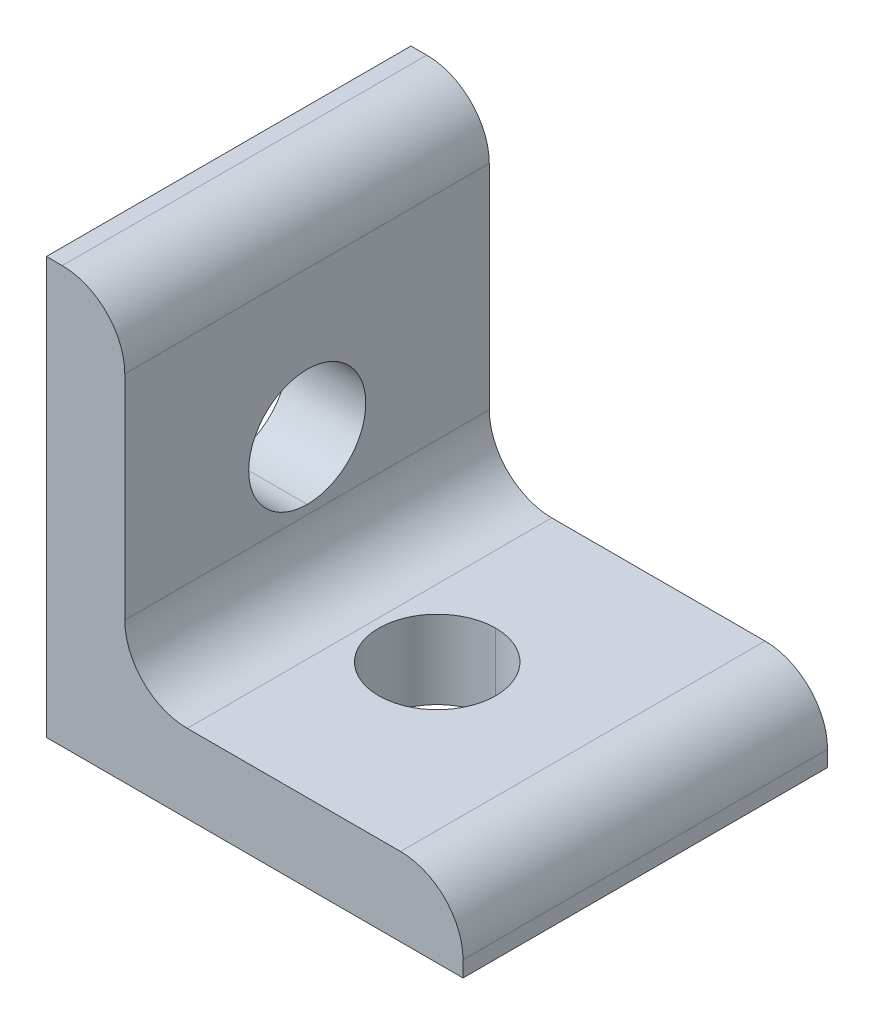
ISO-10303-21;
HEADER;
FILE_DESCRIPTION(('STEP AP214'),'2;1');
FILE_NAME('part.step','',(''),(''),'','','');
FILE_SCHEMA(('AUTOMOTIVE_DESIGN { 1 0 10303 214 1 1 1 1 }'));
ENDSEC;
DATA;
#1=APPLICATION_CONTEXT('core data for automotive mechanical design processes');
#2=APPLICATION_PROTOCOL_DEFINITION('international standard','automotive_design',2000,#1);
#3=PRODUCT_CONTEXT('',#1,'mechanical');
#4=PRODUCT('Part','Part','',(#3));
#5=PRODUCT_RELATED_PRODUCT_CATEGORY('part','',(#4));
#6=PRODUCT_DEFINITION_FORMATION('','',#4);
#7=PRODUCT_DEFINITION_CONTEXT('part definition',#1,'design');
#8=PRODUCT_DEFINITION('design','',#6,#7);
#9=PRODUCT_DEFINITION_SHAPE('','',#8);
#10=(LENGTH_UNIT() NAMED_UNIT(*) SI_UNIT(.MILLI.,.METRE.));
#11=(NAMED_UNIT(*) PLANE_ANGLE_UNIT() SI_UNIT($,.RADIAN.));
#12=(NAMED_UNIT(*) SI_UNIT($,.STERADIAN.) SOLID_ANGLE_UNIT());
#13=UNCERTAINTY_MEASURE_WITH_UNIT(LENGTH_MEASURE(1.E-05),#10,'distance_accuracy_value','');
#14=(GEOMETRIC_REPRESENTATION_CONTEXT(3) GLOBAL_UNCERTAINTY_ASSIGNED_CONTEXT((#13)) GLOBAL_UNIT_ASSIGNED_CONTEXT((#10,
#11,#12)) REPRESENTATION_CONTEXT('',''));
#15=CARTESIAN_POINT('',(0.,0.,0.));
#16=DIRECTION('',(0.,0.,1.));
#17=DIRECTION('',(1.,0.,0.));
#18=AXIS2_PLACEMENT_3D('',#15,#16,#17);
#19=CARTESIAN_POINT('',(12.7,0.,-0.0127));
#20=DIRECTION('',(0.,1.,0.));
#21=DIRECTION('',(0.,0.,-1.));
#22=AXIS2_PLACEMENT_3D('',#19,#20,#21);
#23=CYLINDRICAL_SURFACE('',#22,3.5687);
#24=DIRECTION('',(0.,-1.,0.));
#25=VECTOR('',#24,1.);
#26=CARTESIAN_POINT('',(12.7,4.7752,3.556));
#27=LINE('',#26,#25);
#28=CARTESIAN_POINT('',(12.7,4.7752,3.556));
#29=VERTEX_POINT('',#28);
#30=CARTESIAN_POINT('',(12.7,0.,3.556));
#31=VERTEX_POINT('',#30);
#32=EDGE_CURVE('E19',#29,#31,#27,.T.);
#33=ORIENTED_EDGE('',*,*,#32,.F.);
#34=CARTESIAN_POINT('',(12.7,4.7752,-0.0127));
#35=DIRECTION('',(0.,1.,0.));
#36=DIRECTION('',(0.,0.,1.));
#37=AXIS2_PLACEMENT_3D('',#34,#35,#36);
#38=CIRCLE('',#37,3.5687);
#39=CARTESIAN_POINT('',(12.7,4.7752,-3.5814));
#40=VERTEX_POINT('',#39);
#41=EDGE_CURVE('E160',#29,#40,#38,.T.);
#42=ORIENTED_EDGE('',*,*,#41,.T.);
#43=DIRECTION('',(0.,-1.,0.));
#44=VECTOR('',#43,1.);
#45=CARTESIAN_POINT('',(12.7,4.7752,-3.5814));
#46=LINE('',#45,#44);
#47=CARTESIAN_POINT('',(12.7,0.,-3.5814));
#48=VERTEX_POINT('',#47);
#49=EDGE_CURVE('E10',#40,#48,#46,.T.);
#50=ORIENTED_EDGE('',*,*,#49,.T.);
#51=CARTESIAN_POINT('',(12.7,0.,-0.0127));
#52=DIRECTION('',(0.,-1.,0.));
#53=DIRECTION('',(0.,0.,-1.));
#54=AXIS2_PLACEMENT_3D('',#51,#52,#53);
#55=CIRCLE('',#54,3.5687);
#56=EDGE_CURVE('E182',#48,#31,#55,.T.);
#57=ORIENTED_EDGE('',*,*,#56,.T.);
#58=EDGE_LOOP('',(#33,#42,#50,#57));
#59=FACE_BOUND('',#58,.T.);
#60=ADVANCED_FACE('F16',(#59),#23,.F.);
#61=CARTESIAN_POINT('',(12.7,0.,-0.0127));
#62=DIRECTION('',(0.,1.,0.));
#63=DIRECTION('',(0.,0.,-1.));
#64=AXIS2_PLACEMENT_3D('',#61,#62,#63);
#65=CYLINDRICAL_SURFACE('',#64,3.5687);
#66=ORIENTED_EDGE('',*,*,#49,.F.);
#67=CARTESIAN_POINT('',(12.7,4.7752,-0.0127));
#68=DIRECTION('',(0.,1.,0.));
#69=DIRECTION('',(0.,0.,-1.));
#70=AXIS2_PLACEMENT_3D('',#67,#68,#69);
#71=CIRCLE('',#70,3.5687);
#72=EDGE_CURVE('E157',#40,#29,#71,.T.);
#73=ORIENTED_EDGE('',*,*,#72,.T.);
#74=ORIENTED_EDGE('',*,*,#32,.T.);
#75=CARTESIAN_POINT('',(12.7,0.,-0.0127));
#76=DIRECTION('',(0.,-1.,0.));
#77=DIRECTION('',(0.,0.,1.));
#78=AXIS2_PLACEMENT_3D('',#75,#76,#77);
#79=CIRCLE('',#78,3.5687);
#80=EDGE_CURVE('E179',#31,#48,#79,.T.);
#81=ORIENTED_EDGE('',*,*,#80,.T.);
#82=EDGE_LOOP('',(#66,#73,#74,#81));
#83=FACE_BOUND('',#82,.T.);
#84=ADVANCED_FACE('F221',(#83),#65,.F.);
#85=CARTESIAN_POINT('',(0.,12.7,-0.0127));
#86=DIRECTION('',(1.,0.,0.));
#87=DIRECTION('',(0.,1.,0.));
#88=AXIS2_PLACEMENT_3D('',#85,#86,#87);
#89=CYLINDRICAL_SURFACE('',#88,3.5687);
#90=DIRECTION('',(-1.,0.,0.));
#91=VECTOR('',#90,1.);
#92=CARTESIAN_POINT('',(4.7752,16.2687,-0.0127));
#93=LINE('',#92,#91);
#94=CARTESIAN_POINT('',(4.7752,16.2687,-0.0127));
#95=VERTEX_POINT('',#94);
#96=CARTESIAN_POINT('',(0.,16.2687,-0.0127));
#97=VERTEX_POINT('',#96);
#98=EDGE_CURVE('E30',#95,#97,#93,.T.);
#99=ORIENTED_EDGE('',*,*,#98,.T.);
#100=CARTESIAN_POINT('',(0.,12.7,-0.0127));
#101=DIRECTION('',(-1.,0.,0.));
#102=DIRECTION('',(0.,1.,0.));
#103=AXIS2_PLACEMENT_3D('',#100,#101,#102);
#104=CIRCLE('',#103,3.5687);
#105=CARTESIAN_POINT('',(0.,9.1313,-0.0126999999999994));
#106=VERTEX_POINT('',#105);
#107=EDGE_CURVE('E35',#97,#106,#104,.T.);
#108=ORIENTED_EDGE('',*,*,#107,.T.);
#109=DIRECTION('',(-1.,0.,0.));
#110=VECTOR('',#109,1.);
#111=CARTESIAN_POINT('',(4.7752,9.1313,-0.0126999999999996));
#112=LINE('',#111,#110);
#113=CARTESIAN_POINT('',(4.7752,9.1313,-0.0126999999999994));
#114=VERTEX_POINT('',#113);
#115=EDGE_CURVE('E214',#114,#106,#112,.T.);
#116=ORIENTED_EDGE('',*,*,#115,.F.);
#117=CARTESIAN_POINT('',(4.7752,12.7,-0.0127));
#118=DIRECTION('',(1.,0.,0.));
#119=DIRECTION('',(0.,-1.,0.));
#120=AXIS2_PLACEMENT_3D('',#117,#118,#119);
#121=CIRCLE('',#120,3.5687);
#122=EDGE_CURVE('E147',#114,#95,#121,.T.);
#123=ORIENTED_EDGE('',*,*,#122,.T.);
#124=EDGE_LOOP('',(#99,#108,#116,#123));
#125=FACE_BOUND('',#124,.T.);
#126=ADVANCED_FACE('F268',(#125),#89,.F.);
#127=CARTESIAN_POINT('',(0.,12.7,-0.0127));
#128=DIRECTION('',(1.,0.,0.));
#129=DIRECTION('',(0.,1.,0.));
#130=AXIS2_PLACEMENT_3D('',#127,#128,#129);
#131=CYLINDRICAL_SURFACE('',#130,3.5687);
#132=ORIENTED_EDGE('',*,*,#115,.T.);
#133=CARTESIAN_POINT('',(0.,12.7,-0.0127));
#134=DIRECTION('',(-1.,0.,0.));
#135=DIRECTION('',(0.,-1.,0.));
#136=AXIS2_PLACEMENT_3D('',#133,#134,#135);
#137=CIRCLE('',#136,3.5687);
#138=EDGE_CURVE('E190',#106,#97,#137,.T.);
#139=ORIENTED_EDGE('',*,*,#138,.T.);
#140=ORIENTED_EDGE('',*,*,#98,.F.);
#141=CARTESIAN_POINT('',(4.7752,12.7,-0.0127));
#142=DIRECTION('',(1.,0.,0.));
#143=DIRECTION('',(0.,1.,0.));
#144=AXIS2_PLACEMENT_3D('',#141,#142,#143);
#145=CIRCLE('',#144,3.5687);
#146=EDGE_CURVE('E144',#95,#114,#145,.T.);
#147=ORIENTED_EDGE('',*,*,#146,.T.);
#148=EDGE_LOOP('',(#132,#139,#140,#147));
#149=FACE_BOUND('',#148,.T.);
#150=ADVANCED_FACE('F262',(#149),#131,.F.);
#151=CARTESIAN_POINT('',(0.,0.,11.1125));
#152=DIRECTION('',(0.,0.,1.));
#153=DIRECTION('',(1.,0.,0.));
#154=AXIS2_PLACEMENT_3D('',#151,#152,#153);
#155=PLANE('',#154);
#156=DIRECTION('',(1.,0.,0.));
#157=VECTOR('',#156,1.);
#158=CARTESIAN_POINT('',(0.,25.4,11.1125));
#159=LINE('',#158,#157);
#160=CARTESIAN_POINT('',(0.,25.4,11.1125));
#161=VERTEX_POINT('',#160);
#162=CARTESIAN_POINT('',(0.9652,25.4,11.1125));
#163=VERTEX_POINT('',#162);
#164=EDGE_CURVE('E194',#161,#163,#159,.T.);
#165=ORIENTED_EDGE('',*,*,#164,.F.);
#166=DIRECTION('',(0.,1.,0.));
#167=VECTOR('',#166,1.);
#168=CARTESIAN_POINT('',(0.,0.,11.1125));
#169=LINE('',#168,#167);
#170=CARTESIAN_POINT('',(0.,0.,11.1125));
#171=VERTEX_POINT('',#170);
#172=EDGE_CURVE('E192',#171,#161,#169,.T.);
#173=ORIENTED_EDGE('',*,*,#172,.F.);
#174=DIRECTION('',(-1.,0.,0.));
#175=VECTOR('',#174,1.);
#176=CARTESIAN_POINT('',(25.4,0.,11.1125));
#177=LINE('',#176,#175);
#178=CARTESIAN_POINT('',(25.4,0.,11.1125));
#179=VERTEX_POINT('',#178);
#180=EDGE_CURVE('E183',#179,#171,#177,.T.);
#181=ORIENTED_EDGE('',*,*,#180,.F.);
#182=DIRECTION('',(0.,-1.,0.));
#183=VECTOR('',#182,1.);
#184=CARTESIAN_POINT('',(25.4,0.965200000000254,11.1125));
#185=LINE('',#184,#183);
#186=CARTESIAN_POINT('',(25.4,0.965200000000254,11.1125));
#187=VERTEX_POINT('',#186);
#188=EDGE_CURVE('E178',#187,#179,#185,.T.);
#189=ORIENTED_EDGE('',*,*,#188,.F.);
#190=CARTESIAN_POINT('',(21.59,0.965200000000254,11.1125));
#191=DIRECTION('',(0.,0.,-1.));
#192=DIRECTION('',(7.60364358236553E-13,1.,0.));
#193=AXIS2_PLACEMENT_3D('',#190,#191,#192);
#194=CIRCLE('',#193,3.81);
#195=CARTESIAN_POINT('',(21.590000000001,4.77520000000008,11.1125));
#196=VERTEX_POINT('',#195);
#197=EDGE_CURVE('E166',#196,#187,#194,.T.);
#198=ORIENTED_EDGE('',*,*,#197,.F.);
#199=DIRECTION('',(1.,0.,0.));
#200=VECTOR('',#199,1.);
#201=CARTESIAN_POINT('',(8.58520000000001,4.7752,11.1125));
#202=LINE('',#201,#200);
#203=CARTESIAN_POINT('',(8.5852,4.7752,11.1125));
#204=VERTEX_POINT('',#203);
#205=EDGE_CURVE('E161',#204,#196,#202,.T.);
#206=ORIENTED_EDGE('',*,*,#205,.F.);
#207=CARTESIAN_POINT('',(8.5852,8.5852,11.1125));
#208=DIRECTION('',(0.,0.,1.));
#209=DIRECTION('',(-1.,0.,0.));
#210=AXIS2_PLACEMENT_3D('',#207,#208,#209);
#211=CIRCLE('',#210,3.81);
#212=CARTESIAN_POINT('',(4.7752,8.5852,11.1125));
#213=VERTEX_POINT('',#212);
#214=EDGE_CURVE('E154',#213,#204,#211,.T.);
#215=ORIENTED_EDGE('',*,*,#214,.F.);
#216=DIRECTION('',(0.,-1.,0.));
#217=VECTOR('',#216,1.);
#218=CARTESIAN_POINT('',(4.7752,21.59,11.1125));
#219=LINE('',#218,#217);
#220=CARTESIAN_POINT('',(4.7752,21.59,11.1125));
#221=VERTEX_POINT('',#220);
#222=EDGE_CURVE('E148',#221,#213,#219,.T.);
#223=ORIENTED_EDGE('',*,*,#222,.F.);
#224=CARTESIAN_POINT('',(0.9652,21.59,11.1125));
#225=DIRECTION('',(0.,0.,-1.));
#226=DIRECTION('',(0.,1.,0.));
#227=AXIS2_PLACEMENT_3D('',#224,#225,#226);
#228=CIRCLE('',#227,3.81);
#229=EDGE_CURVE('E128',#163,#221,#228,.T.);
#230=ORIENTED_EDGE('',*,*,#229,.F.);
#231=EDGE_LOOP('',(#165,#173,#181,#189,#198,#206,#215,#223,#230));
#232=FACE_BOUND('',#231,.T.);
#233=ADVANCED_FACE('F241',(#232),#155,.T.);
#234=CARTESIAN_POINT('',(4.7752,25.4,-11.1125));
#235=DIRECTION('',(0.,1.,0.));
#236=DIRECTION('',(-1.,0.,0.));
#237=AXIS2_PLACEMENT_3D('',#234,#235,#236);
#238=PLANE('',#237);
#239=DIRECTION('',(1.,0.,0.));
#240=VECTOR('',#239,1.);
#241=CARTESIAN_POINT('',(0.,25.4,-11.1125));
#242=LINE('',#241,#240);
#243=CARTESIAN_POINT('',(0.,25.4,-11.1125));
#244=VERTEX_POINT('',#243);
#245=CARTESIAN_POINT('',(0.9652,25.4,-11.1125));
#246=VERTEX_POINT('',#245);
#247=EDGE_CURVE('E132',#244,#246,#242,.T.);
#248=ORIENTED_EDGE('',*,*,#247,.F.);
#249=DIRECTION('',(0.,0.,-1.));
#250=VECTOR('',#249,1.);
#251=CARTESIAN_POINT('',(0.,25.4,11.1125));
#252=LINE('',#251,#250);
#253=EDGE_CURVE('E185',#161,#244,#252,.T.);
#254=ORIENTED_EDGE('',*,*,#253,.F.);
#255=ORIENTED_EDGE('',*,*,#164,.T.);
#256=DIRECTION('',(0.,0.,-1.));
#257=VECTOR('',#256,1.);
#258=CARTESIAN_POINT('',(0.9652,25.4,11.1125));
#259=LINE('',#258,#257);
#260=EDGE_CURVE('E142',#163,#246,#259,.T.);
#261=ORIENTED_EDGE('',*,*,#260,.T.);
#262=EDGE_LOOP('',(#248,#254,#255,#261));
#263=FACE_BOUND('',#262,.T.);
#264=ADVANCED_FACE('F252',(#263),#238,.T.);
#265=CARTESIAN_POINT('',(0.,25.4,-11.1125));
#266=DIRECTION('',(-1.,0.,0.));
#267=DIRECTION('',(0.,-1.,0.));
#268=AXIS2_PLACEMENT_3D('',#265,#266,#267);
#269=PLANE('',#268);
#270=ORIENTED_EDGE('',*,*,#107,.F.);
#271=ORIENTED_EDGE('',*,*,#138,.F.);
#272=EDGE_LOOP('',(#270,#271));
#273=FACE_BOUND('',#272,.T.);
#274=DIRECTION('',(0.,0.,-1.));
#275=VECTOR('',#274,1.);
#276=CARTESIAN_POINT('',(0.,0.,11.1125));
#277=LINE('',#276,#275);
#278=CARTESIAN_POINT('',(0.,0.,-11.1125));
#279=VERTEX_POINT('',#278);
#280=EDGE_CURVE('E187',#171,#279,#277,.T.);
#281=ORIENTED_EDGE('',*,*,#280,.F.);
#282=ORIENTED_EDGE('',*,*,#172,.T.);
#283=ORIENTED_EDGE('',*,*,#253,.T.);
#284=DIRECTION('',(0.,1.,0.));
#285=VECTOR('',#284,1.);
#286=CARTESIAN_POINT('',(0.,0.,-11.1125));
#287=LINE('',#286,#285);
#288=EDGE_CURVE('E134',#279,#244,#287,.T.);
#289=ORIENTED_EDGE('',*,*,#288,.F.);
#290=EDGE_LOOP('',(#281,#282,#283,#289));
#291=FACE_BOUND('',#290,.T.);
#292=ADVANCED_FACE('F249',(#273,#291),#269,.T.);
#293=CARTESIAN_POINT('',(0.,0.,-11.1125));
#294=DIRECTION('',(0.,-1.,0.));
#295=DIRECTION('',(1.,0.,0.));
#296=AXIS2_PLACEMENT_3D('',#293,#294,#295);
#297=PLANE('',#296);
#298=ORIENTED_EDGE('',*,*,#56,.F.);
#299=ORIENTED_EDGE('',*,*,#80,.F.);
#300=EDGE_LOOP('',(#298,#299));
#301=FACE_BOUND('',#300,.T.);
#302=DIRECTION('',(0.,0.,-1.));
#303=VECTOR('',#302,1.);
#304=CARTESIAN_POINT('',(25.4,0.,11.1125));
#305=LINE('',#304,#303);
#306=CARTESIAN_POINT('',(25.4,0.,-11.1125));
#307=VERTEX_POINT('',#306);
#308=EDGE_CURVE('E175',#179,#307,#305,.T.);
#309=ORIENTED_EDGE('',*,*,#308,.F.);
#310=ORIENTED_EDGE('',*,*,#180,.T.);
#311=ORIENTED_EDGE('',*,*,#280,.T.);
#312=DIRECTION('',(-1.,0.,0.));
#313=VECTOR('',#312,1.);
#314=CARTESIAN_POINT('',(25.4,0.,-11.1125));
#315=LINE('',#314,#313);
#316=EDGE_CURVE('E172',#307,#279,#315,.T.);
#317=ORIENTED_EDGE('',*,*,#316,.F.);
#318=EDGE_LOOP('',(#309,#310,#311,#317));
#319=FACE_BOUND('',#318,.T.);
#320=ADVANCED_FACE('F227',(#301,#319),#297,.T.);
#321=CARTESIAN_POINT('',(25.4,0.,-11.1125));
#322=DIRECTION('',(1.,0.,0.));
#323=DIRECTION('',(0.,1.,0.));
#324=AXIS2_PLACEMENT_3D('',#321,#322,#323);
#325=PLANE('',#324);
#326=ORIENTED_EDGE('',*,*,#188,.T.);
#327=ORIENTED_EDGE('',*,*,#308,.T.);
#328=DIRECTION('',(0.,-1.,0.));
#329=VECTOR('',#328,1.);
#330=CARTESIAN_POINT('',(25.4,0.965200000000254,-11.1125));
#331=LINE('',#330,#329);
#332=CARTESIAN_POINT('',(25.4,0.965200000000254,-11.1125));
#333=VERTEX_POINT('',#332);
#334=EDGE_CURVE('E140',#333,#307,#331,.T.);
#335=ORIENTED_EDGE('',*,*,#334,.F.);
#336=DIRECTION('',(0.,0.,1.));
#337=VECTOR('',#336,1.);
#338=CARTESIAN_POINT('',(25.4,0.965200000000254,-11.1125));
#339=LINE('',#338,#337);
#340=EDGE_CURVE('E163',#333,#187,#339,.T.);
#341=ORIENTED_EDGE('',*,*,#340,.T.);
#342=EDGE_LOOP('',(#326,#327,#335,#341));
#343=FACE_BOUND('',#342,.T.);
#344=ADVANCED_FACE('F245',(#343),#325,.T.);
#345=CARTESIAN_POINT('',(21.59,0.965200000000254,40.08501));
#346=DIRECTION('',(0.,0.,-1.));
#347=DIRECTION('',(0.,1.,0.));
#348=AXIS2_PLACEMENT_3D('',#345,#346,#347);
#349=CYLINDRICAL_SURFACE('',#348,3.81);
#350=DIRECTION('',(0.,0.,-1.));
#351=VECTOR('',#350,1.);
#352=CARTESIAN_POINT('',(21.59,4.77520000000025,11.1125));
#353=LINE('',#352,#351);
#354=CARTESIAN_POINT('',(21.590000000001,4.77520000000008,-11.1125));
#355=VERTEX_POINT('',#354);
#356=EDGE_CURVE('E167',#196,#355,#353,.T.);
#357=ORIENTED_EDGE('',*,*,#356,.F.);
#358=ORIENTED_EDGE('',*,*,#197,.T.);
#359=ORIENTED_EDGE('',*,*,#340,.F.);
#360=CARTESIAN_POINT('',(21.59,0.965200000000254,-11.1125));
#361=DIRECTION('',(0.,0.,1.));
#362=DIRECTION('',(1.,0.,0.));
#363=AXIS2_PLACEMENT_3D('',#360,#361,#362);
#364=CIRCLE('',#363,3.81);
#365=EDGE_CURVE('E137',#333,#355,#364,.T.);
#366=ORIENTED_EDGE('',*,*,#365,.T.);
#367=EDGE_LOOP('',(#357,#358,#359,#366));
#368=FACE_BOUND('',#367,.T.);
#369=ADVANCED_FACE('F234',(#368),#349,.T.);
#370=CARTESIAN_POINT('',(25.4,4.7752,-11.1125));
#371=DIRECTION('',(0.,1.,0.));
#372=DIRECTION('',(-1.,0.,0.));
#373=AXIS2_PLACEMENT_3D('',#370,#371,#372);
#374=PLANE('',#373);
#375=ORIENTED_EDGE('',*,*,#41,.F.);
#376=ORIENTED_EDGE('',*,*,#72,.F.);
#377=EDGE_LOOP('',(#375,#376));
#378=FACE_BOUND('',#377,.T.);
#379=DIRECTION('',(1.,0.,0.));
#380=VECTOR('',#379,1.);
#381=CARTESIAN_POINT('',(8.5852,4.7752,-11.1125));
#382=LINE('',#381,#380);
#383=CARTESIAN_POINT('',(8.5852,4.7752,-11.1125));
#384=VERTEX_POINT('',#383);
#385=EDGE_CURVE('E139',#384,#355,#382,.T.);
#386=ORIENTED_EDGE('',*,*,#385,.F.);
#387=DIRECTION('',(0.,0.,1.));
#388=VECTOR('',#387,1.);
#389=CARTESIAN_POINT('',(8.5852,4.7752,-11.1125));
#390=LINE('',#389,#388);
#391=EDGE_CURVE('E150',#384,#204,#390,.T.);
#392=ORIENTED_EDGE('',*,*,#391,.T.);
#393=ORIENTED_EDGE('',*,*,#205,.T.);
#394=ORIENTED_EDGE('',*,*,#356,.T.);
#395=EDGE_LOOP('',(#386,#392,#393,#394));
#396=FACE_BOUND('',#395,.T.);
#397=ADVANCED_FACE('F230',(#378,#396),#374,.T.);
#398=CARTESIAN_POINT('',(8.5852,8.5852,-40.08501));
#399=DIRECTION('',(0.,0.,1.));
#400=DIRECTION('',(-1.,0.,0.));
#401=AXIS2_PLACEMENT_3D('',#398,#399,#400);
#402=CYLINDRICAL_SURFACE('',#401,3.81);
#403=ORIENTED_EDGE('',*,*,#214,.T.);
#404=ORIENTED_EDGE('',*,*,#391,.F.);
#405=CARTESIAN_POINT('',(8.5852,8.5852,-11.1125));
#406=DIRECTION('',(0.,0.,-1.));
#407=DIRECTION('',(0.,-1.,0.));
#408=AXIS2_PLACEMENT_3D('',#405,#406,#407);
#409=CIRCLE('',#408,3.81);
#410=CARTESIAN_POINT('',(4.7752,8.5852,-11.1125));
#411=VERTEX_POINT('',#410);
#412=EDGE_CURVE('E120',#384,#411,#409,.T.);
#413=ORIENTED_EDGE('',*,*,#412,.T.);
#414=DIRECTION('',(0.,0.,-1.));
#415=VECTOR('',#414,1.);
#416=CARTESIAN_POINT('',(4.7752,8.5852,11.1125));
#417=LINE('',#416,#415);
#418=EDGE_CURVE('E116',#213,#411,#417,.T.);
#419=ORIENTED_EDGE('',*,*,#418,.F.);
#420=EDGE_LOOP('',(#403,#404,#413,#419));
#421=FACE_BOUND('',#420,.T.);
#422=ADVANCED_FACE('F233',(#421),#402,.F.);
#423=CARTESIAN_POINT('',(4.7752,4.7752,-11.1125));
#424=DIRECTION('',(1.,0.,0.));
#425=DIRECTION('',(0.,1.,0.));
#426=AXIS2_PLACEMENT_3D('',#423,#424,#425);
#427=PLANE('',#426);
#428=ORIENTED_EDGE('',*,*,#122,.F.);
#429=ORIENTED_EDGE('',*,*,#146,.F.);
#430=EDGE_LOOP('',(#428,#429));
#431=FACE_BOUND('',#430,.T.);
#432=ORIENTED_EDGE('',*,*,#222,.T.);
#433=ORIENTED_EDGE('',*,*,#418,.T.);
#434=DIRECTION('',(0.,-1.,0.));
#435=VECTOR('',#434,1.);
#436=CARTESIAN_POINT('',(4.7752,21.59,-11.1125));
#437=LINE('',#436,#435);
#438=CARTESIAN_POINT('',(4.7752,21.59,-11.1125));
#439=VERTEX_POINT('',#438);
#440=EDGE_CURVE('E109',#439,#411,#437,.T.);
#441=ORIENTED_EDGE('',*,*,#440,.F.);
#442=DIRECTION('',(0.,0.,1.));
#443=VECTOR('',#442,1.);
#444=CARTESIAN_POINT('',(4.7752,21.59,-11.1125));
#445=LINE('',#444,#443);
#446=EDGE_CURVE('E113',#439,#221,#445,.T.);
#447=ORIENTED_EDGE('',*,*,#446,.T.);
#448=EDGE_LOOP('',(#432,#433,#441,#447));
#449=FACE_BOUND('',#448,.T.);
#450=ADVANCED_FACE('F112',(#431,#449),#427,.T.);
#451=CARTESIAN_POINT('',(0.9652,21.59,40.08501));
#452=DIRECTION('',(0.,0.,-1.));
#453=DIRECTION('',(0.,1.,0.));
#454=AXIS2_PLACEMENT_3D('',#451,#452,#453);
#455=CYLINDRICAL_SURFACE('',#454,3.81);
#456=ORIENTED_EDGE('',*,*,#260,.F.);
#457=ORIENTED_EDGE('',*,*,#229,.T.);
#458=ORIENTED_EDGE('',*,*,#446,.F.);
#459=CARTESIAN_POINT('',(0.9652,21.59,-11.1125));
#460=DIRECTION('',(0.,0.,1.));
#461=DIRECTION('',(1.,0.,0.));
#462=AXIS2_PLACEMENT_3D('',#459,#460,#461);
#463=CIRCLE('',#462,3.81);
#464=EDGE_CURVE('E126',#439,#246,#463,.T.);
#465=ORIENTED_EDGE('',*,*,#464,.T.);
#466=EDGE_LOOP('',(#456,#457,#458,#465));
#467=FACE_BOUND('',#466,.T.);
#468=ADVANCED_FACE('F125',(#467),#455,.T.);
#469=CARTESIAN_POINT('',(0.,0.,-11.1125));
#470=DIRECTION('',(0.,0.,1.));
#471=DIRECTION('',(1.,0.,0.));
#472=AXIS2_PLACEMENT_3D('',#469,#470,#471);
#473=PLANE('',#472);
#474=ORIENTED_EDGE('',*,*,#440,.T.);
#475=ORIENTED_EDGE('',*,*,#412,.F.);
#476=ORIENTED_EDGE('',*,*,#385,.T.);
#477=ORIENTED_EDGE('',*,*,#365,.F.);
#478=ORIENTED_EDGE('',*,*,#334,.T.);
#479=ORIENTED_EDGE('',*,*,#316,.T.);
#480=ORIENTED_EDGE('',*,*,#288,.T.);
#481=ORIENTED_EDGE('',*,*,#247,.T.);
#482=ORIENTED_EDGE('',*,*,#464,.F.);
#483=EDGE_LOOP('',(#474,#475,#476,#477,#478,#479,#480,#481,#482));
#484=FACE_BOUND('',#483,.T.);
#485=ADVANCED_FACE('F130',(#484),#473,.F.);
#486=CLOSED_SHELL('',(#60,#84,#126,#150,#233,#264,#292,#320,#344,#369,#397,#422,#450,#468,#485));
#487=MANIFOLD_SOLID_BREP('B1',#486);
#488=ADVANCED_BREP_SHAPE_REPRESENTATION('',(#18,#487),#14);
#489=SHAPE_DEFINITION_REPRESENTATION(#9,#488);
ENDSEC;
END-ISO-10303-21;
